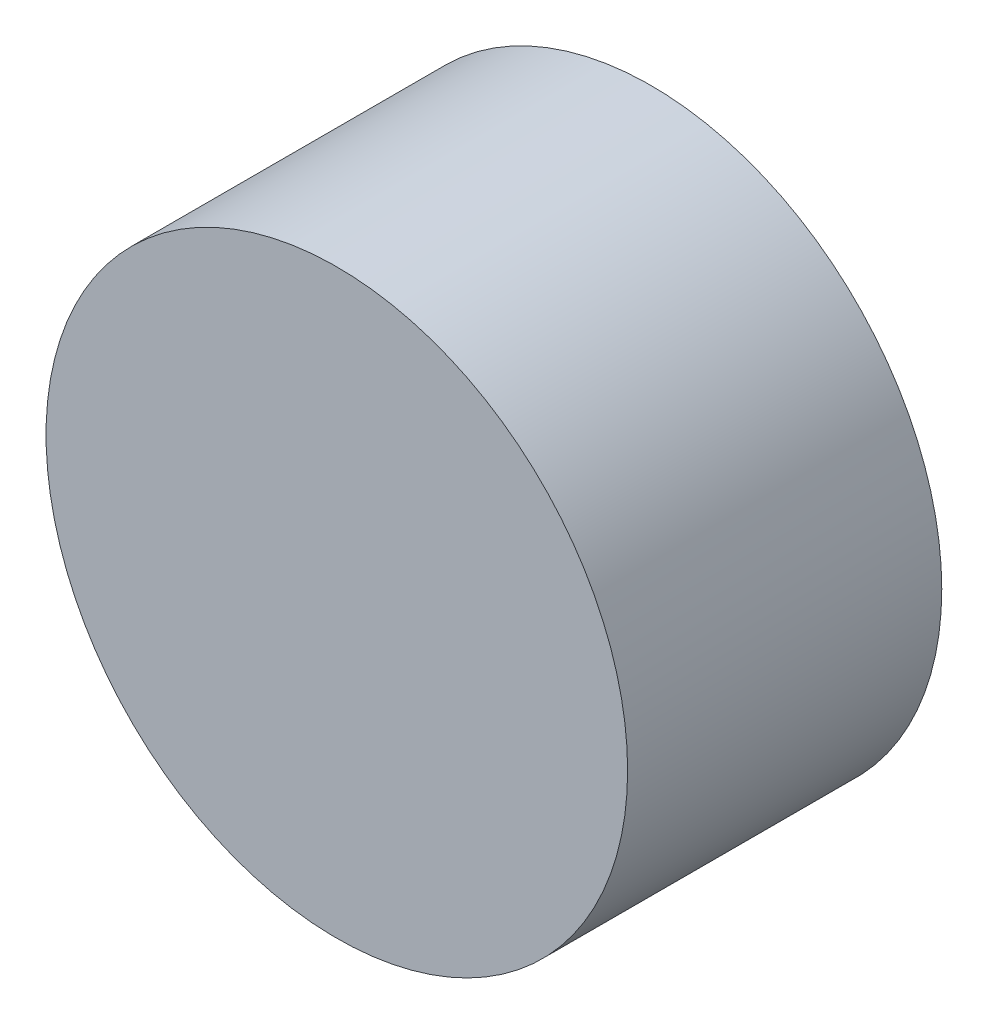
ISO-10303-21;
HEADER;
FILE_DESCRIPTION(('STEP AP214'),'2;1');
FILE_NAME('part.step','',(''),(''),'','','');
FILE_SCHEMA(('AUTOMOTIVE_DESIGN { 1 0 10303 214 1 1 1 1 }'));
ENDSEC;
DATA;
#1=APPLICATION_CONTEXT('core data for automotive mechanical design processes');
#2=APPLICATION_PROTOCOL_DEFINITION('international standard','automotive_design',2000,#1);
#3=PRODUCT_CONTEXT('',#1,'mechanical');
#4=PRODUCT('Part','Part','',(#3));
#5=PRODUCT_RELATED_PRODUCT_CATEGORY('part','',(#4));
#6=PRODUCT_DEFINITION_FORMATION('','',#4);
#7=PRODUCT_DEFINITION_CONTEXT('part definition',#1,'design');
#8=PRODUCT_DEFINITION('design','',#6,#7);
#9=PRODUCT_DEFINITION_SHAPE('','',#8);
#10=(LENGTH_UNIT() NAMED_UNIT(*) SI_UNIT(.MILLI.,.METRE.));
#11=(NAMED_UNIT(*) PLANE_ANGLE_UNIT() SI_UNIT($,.RADIAN.));
#12=(NAMED_UNIT(*) SI_UNIT($,.STERADIAN.) SOLID_ANGLE_UNIT());
#13=UNCERTAINTY_MEASURE_WITH_UNIT(LENGTH_MEASURE(1.E-05),#10,'distance_accuracy_value','');
#14=(GEOMETRIC_REPRESENTATION_CONTEXT(3) GLOBAL_UNCERTAINTY_ASSIGNED_CONTEXT((#13)) GLOBAL_UNIT_ASSIGNED_CONTEXT((#10,
#11,#12)) REPRESENTATION_CONTEXT('',''));
#15=CARTESIAN_POINT('',(0.,0.,0.));
#16=DIRECTION('',(0.,0.,1.));
#17=DIRECTION('',(1.,0.,0.));
#18=AXIS2_PLACEMENT_3D('',#15,#16,#17);
#19=CARTESIAN_POINT('',(0.,0.,37.));
#20=DIRECTION('',(0.,0.,-1.));
#21=DIRECTION('',(-1.,0.,0.));
#22=AXIS2_PLACEMENT_3D('',#19,#20,#21);
#23=CYLINDRICAL_SURFACE('',#22,34.25);
#24=CARTESIAN_POINT('',(0.,0.,37.));
#25=DIRECTION('',(0.,0.,1.));
#26=DIRECTION('',(1.,0.,0.));
#27=AXIS2_PLACEMENT_3D('',#24,#25,#26);
#28=CIRCLE('',#27,34.25);
#29=CARTESIAN_POINT('',(34.25,0.,37.));
#30=VERTEX_POINT('',#29);
#31=EDGE_CURVE('E10',#30,#30,#28,.T.);
#32=ORIENTED_EDGE('',*,*,#31,.F.);
#33=EDGE_LOOP('',(#32));
#34=FACE_BOUND('',#33,.T.);
#35=CARTESIAN_POINT('',(0.,0.,0.));
#36=DIRECTION('',(0.,0.,1.));
#37=DIRECTION('',(1.,0.,0.));
#38=AXIS2_PLACEMENT_3D('',#35,#36,#37);
#39=CIRCLE('',#38,34.25);
#40=CARTESIAN_POINT('',(34.25,0.,0.));
#41=VERTEX_POINT('',#40);
#42=EDGE_CURVE('E37',#41,#41,#39,.T.);
#43=ORIENTED_EDGE('',*,*,#42,.T.);
#44=EDGE_LOOP('',(#43));
#45=FACE_BOUND('',#44,.T.);
#46=ADVANCED_FACE('F40',(#34,#45),#23,.T.);
#47=CARTESIAN_POINT('',(0.,0.,37.));
#48=DIRECTION('',(0.,0.,1.));
#49=DIRECTION('',(1.,0.,0.));
#50=AXIS2_PLACEMENT_3D('',#47,#48,#49);
#51=PLANE('',#50);
#52=ORIENTED_EDGE('',*,*,#31,.T.);
#53=EDGE_LOOP('',(#52));
#54=FACE_BOUND('',#53,.T.);
#55=ADVANCED_FACE('F55',(#54),#51,.T.);
#56=CARTESIAN_POINT('',(0.,0.,0.));
#57=DIRECTION('',(0.,0.,1.));
#58=DIRECTION('',(1.,0.,0.));
#59=AXIS2_PLACEMENT_3D('',#56,#57,#58);
#60=PLANE('',#59);
#61=ORIENTED_EDGE('',*,*,#42,.F.);
#62=EDGE_LOOP('',(#61));
#63=FACE_BOUND('',#62,.T.);
#64=ADVANCED_FACE('F49',(#63),#60,.F.);
#65=CLOSED_SHELL('',(#46,#55,#64));
#66=MANIFOLD_SOLID_BREP('B2',#65);
#67=ADVANCED_BREP_SHAPE_REPRESENTATION('',(#18,#66),#14);
#68=SHAPE_DEFINITION_REPRESENTATION(#9,#67);
ENDSEC;
END-ISO-10303-21;
